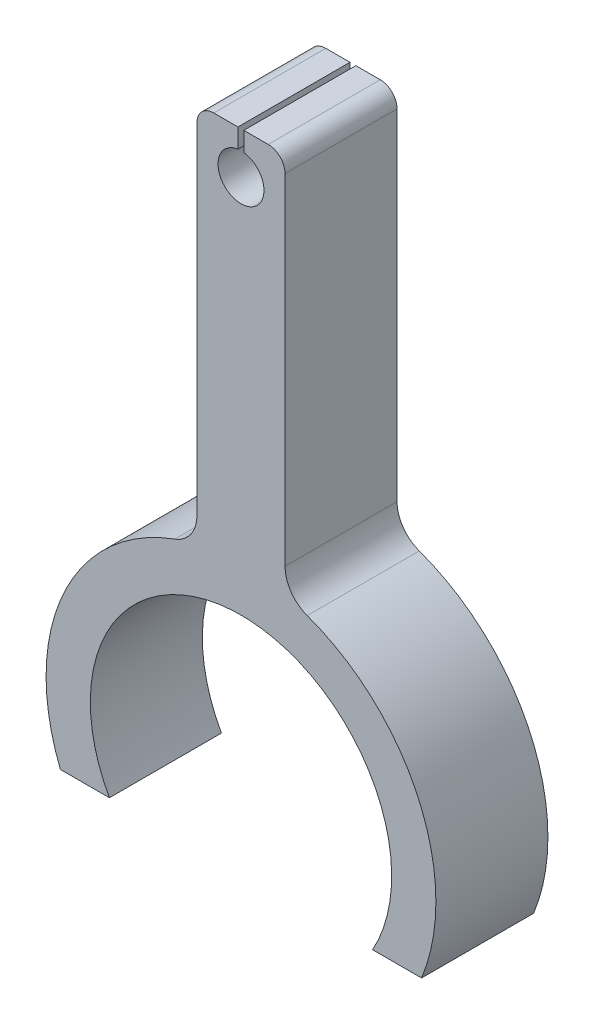
ISO-10303-21;
HEADER;
FILE_DESCRIPTION(('STEP AP214'),'2;1');
FILE_NAME('part.step','',(''),(''),'','','');
FILE_SCHEMA(('AUTOMOTIVE_DESIGN { 1 0 10303 214 1 1 1 1 }'));
ENDSEC;
DATA;
#1=APPLICATION_CONTEXT('core data for automotive mechanical design processes');
#2=APPLICATION_PROTOCOL_DEFINITION('international standard','automotive_design',2000,#1);
#3=PRODUCT_CONTEXT('',#1,'mechanical');
#4=PRODUCT('Part','Part','',(#3));
#5=PRODUCT_RELATED_PRODUCT_CATEGORY('part','',(#4));
#6=PRODUCT_DEFINITION_FORMATION('','',#4);
#7=PRODUCT_DEFINITION_CONTEXT('part definition',#1,'design');
#8=PRODUCT_DEFINITION('design','',#6,#7);
#9=PRODUCT_DEFINITION_SHAPE('','',#8);
#10=(LENGTH_UNIT() NAMED_UNIT(*) SI_UNIT(.MILLI.,.METRE.));
#11=(NAMED_UNIT(*) PLANE_ANGLE_UNIT() SI_UNIT($,.RADIAN.));
#12=(NAMED_UNIT(*) SI_UNIT($,.STERADIAN.) SOLID_ANGLE_UNIT());
#13=UNCERTAINTY_MEASURE_WITH_UNIT(LENGTH_MEASURE(1.E-05),#10,'distance_accuracy_value','');
#14=(GEOMETRIC_REPRESENTATION_CONTEXT(3) GLOBAL_UNCERTAINTY_ASSIGNED_CONTEXT((#13)) GLOBAL_UNIT_ASSIGNED_CONTEXT((#10,
#11,#12)) REPRESENTATION_CONTEXT('',''));
#15=CARTESIAN_POINT('',(0.,0.,0.));
#16=DIRECTION('',(0.,0.,1.));
#17=DIRECTION('',(1.,0.,0.));
#18=AXIS2_PLACEMENT_3D('',#15,#16,#17);
#19=CARTESIAN_POINT('',(-3.93291922947712,51.0522626497168,10.));
#20=DIRECTION('',(0.,1.,0.));
#21=DIRECTION('',(0.,0.,1.));
#22=AXIS2_PLACEMENT_3D('',#19,#20,#21);
#23=PLANE('',#22);
#24=DIRECTION('',(0.,0.,1.));
#25=VECTOR('',#24,1.);
#26=CARTESIAN_POINT('',(-0.269258515594854,51.0522626497168,0.));
#27=LINE('',#26,#25);
#28=CARTESIAN_POINT('',(-0.269258515594854,51.0522626497168,0.));
#29=VERTEX_POINT('',#28);
#30=CARTESIAN_POINT('',(-0.269258515594854,51.0522626497168,10.));
#31=VERTEX_POINT('',#30);
#32=EDGE_CURVE('E177',#29,#31,#27,.T.);
#33=ORIENTED_EDGE('',*,*,#32,.F.);
#34=DIRECTION('',(1.,0.,0.));
#35=VECTOR('',#34,1.);
#36=CARTESIAN_POINT('',(-3.93291922947712,51.0522626497168,0.));
#37=LINE('',#36,#35);
#38=CARTESIAN_POINT('',(-2.43291922947712,51.0522626497168,0.));
#39=VERTEX_POINT('',#38);
#40=EDGE_CURVE('E202',#39,#29,#37,.T.);
#41=ORIENTED_EDGE('',*,*,#40,.F.);
#42=DIRECTION('',(0.,0.,-1.));
#43=VECTOR('',#42,1.);
#44=CARTESIAN_POINT('',(-2.43291922947712,51.0522626497168,10.));
#45=LINE('',#44,#43);
#46=CARTESIAN_POINT('',(-2.43291922947712,51.0522626497168,10.));
#47=VERTEX_POINT('',#46);
#48=EDGE_CURVE('E241',#39,#47,#45,.F.);
#49=ORIENTED_EDGE('',*,*,#48,.T.);
#50=DIRECTION('',(1.,0.,0.));
#51=VECTOR('',#50,1.);
#52=CARTESIAN_POINT('',(-3.93291922947712,51.0522626497168,10.));
#53=LINE('',#52,#51);
#54=EDGE_CURVE('E180',#47,#31,#53,.T.);
#55=ORIENTED_EDGE('',*,*,#54,.T.);
#56=EDGE_LOOP('',(#33,#41,#49,#55));
#57=FACE_BOUND('',#56,.T.);
#58=ADVANCED_FACE('F33',(#57),#23,.T.);
#59=DIRECTION('',(0.,0.,1.));
#60=VECTOR('',#59,1.);
#61=CARTESIAN_POINT('',(0.25121281518814,51.0522626497168,0.));
#62=LINE('',#61,#60);
#63=CARTESIAN_POINT('',(0.25121281518814,51.0522626497168,0.));
#64=VERTEX_POINT('',#63);
#65=CARTESIAN_POINT('',(0.25121281518814,51.0522626497168,10.));
#66=VERTEX_POINT('',#65);
#67=EDGE_CURVE('E48',#64,#66,#62,.T.);
#68=ORIENTED_EDGE('',*,*,#67,.T.);
#69=CARTESIAN_POINT('',(2.43291922947712,51.0522626497168,10.));
#70=VERTEX_POINT('',#69);
#71=EDGE_CURVE('E184',#66,#70,#53,.T.);
#72=ORIENTED_EDGE('',*,*,#71,.T.);
#73=DIRECTION('',(0.,0.,-1.));
#74=VECTOR('',#73,1.);
#75=CARTESIAN_POINT('',(2.43291922947712,51.0522626497168,10.));
#76=LINE('',#75,#74);
#77=CARTESIAN_POINT('',(2.43291922947712,51.0522626497168,0.));
#78=VERTEX_POINT('',#77);
#79=EDGE_CURVE('E238',#70,#78,#76,.T.);
#80=ORIENTED_EDGE('',*,*,#79,.T.);
#81=EDGE_CURVE('E176',#64,#78,#37,.T.);
#82=ORIENTED_EDGE('',*,*,#81,.F.);
#83=EDGE_LOOP('',(#68,#72,#80,#82));
#84=FACE_BOUND('',#83,.T.);
#85=ADVANCED_FACE('F284',(#84),#23,.T.);
#86=CARTESIAN_POINT('',(-3.93291922947712,51.0522626497168,10.));
#87=DIRECTION('',(1.,0.,0.));
#88=DIRECTION('',(0.,1.,0.));
#89=AXIS2_PLACEMENT_3D('',#86,#87,#88);
#90=PLANE('',#89);
#91=DIRECTION('',(0.,-1.,0.));
#92=VECTOR('',#91,1.);
#93=CARTESIAN_POINT('',(-3.93291922947712,51.0522626497168,0.));
#94=LINE('',#93,#92);
#95=CARTESIAN_POINT('',(-3.93291922947712,49.5522626497168,0.));
#96=VERTEX_POINT('',#95);
#97=CARTESIAN_POINT('',(-3.93291922947713,19.1857924245402,0.));
#98=VERTEX_POINT('',#97);
#99=EDGE_CURVE('E219',#96,#98,#94,.T.);
#100=ORIENTED_EDGE('',*,*,#99,.T.);
#101=DIRECTION('',(0.,0.,1.));
#102=VECTOR('',#101,1.);
#103=CARTESIAN_POINT('',(-3.93291922947713,19.1857924245402,10.));
#104=LINE('',#103,#102);
#105=CARTESIAN_POINT('',(-3.93291922947713,19.1857924245402,10.));
#106=VERTEX_POINT('',#105);
#107=EDGE_CURVE('E253',#98,#106,#104,.T.);
#108=ORIENTED_EDGE('',*,*,#107,.T.);
#109=DIRECTION('',(0.,-1.,0.));
#110=VECTOR('',#109,1.);
#111=CARTESIAN_POINT('',(-3.93291922947712,51.0522626497168,10.));
#112=LINE('',#111,#110);
#113=CARTESIAN_POINT('',(-3.93291922947712,49.5522626497168,10.));
#114=VERTEX_POINT('',#113);
#115=EDGE_CURVE('E198',#114,#106,#112,.T.);
#116=ORIENTED_EDGE('',*,*,#115,.F.);
#117=DIRECTION('',(0.,0.,-1.));
#118=VECTOR('',#117,1.);
#119=CARTESIAN_POINT('',(-3.93291922947712,49.5522626497168,0.));
#120=LINE('',#119,#118);
#121=EDGE_CURVE('E225',#114,#96,#120,.T.);
#122=ORIENTED_EDGE('',*,*,#121,.T.);
#123=EDGE_LOOP('',(#100,#108,#116,#122));
#124=FACE_BOUND('',#123,.T.);
#125=ADVANCED_FACE('F286',(#124),#90,.F.);
#126=CARTESIAN_POINT('',(0.,0.,10.));
#127=DIRECTION('',(0.,0.,-1.));
#128=DIRECTION('',(-1.,0.,0.));
#129=AXIS2_PLACEMENT_3D('',#126,#127,#128);
#130=CYLINDRICAL_SURFACE('',#129,17.4);
#131=CARTESIAN_POINT('',(0.,0.,10.));
#132=DIRECTION('',(0.,0.,1.));
#133=DIRECTION('',(1.,0.,0.));
#134=AXIS2_PLACEMENT_3D('',#131,#132,#133);
#135=CIRCLE('',#134,17.4);
#136=CARTESIAN_POINT('',(-5.91337228396579,16.3643523621079,10.));
#137=VERTEX_POINT('',#136);
#138=CARTESIAN_POINT('',(-16.1199720501201,-6.55030542061571,10.));
#139=VERTEX_POINT('',#138);
#140=EDGE_CURVE('E196',#137,#139,#135,.T.);
#141=ORIENTED_EDGE('',*,*,#140,.F.);
#142=DIRECTION('',(0.,0.,-1.));
#143=VECTOR('',#142,1.);
#144=CARTESIAN_POINT('',(-5.91337228396579,16.3643523621079,10.));
#145=LINE('',#144,#143);
#146=CARTESIAN_POINT('',(-5.91337228396579,16.3643523621079,0.));
#147=VERTEX_POINT('',#146);
#148=EDGE_CURVE('E250',#137,#147,#145,.T.);
#149=ORIENTED_EDGE('',*,*,#148,.T.);
#150=CARTESIAN_POINT('',(0.,0.,0.));
#151=DIRECTION('',(0.,0.,1.));
#152=DIRECTION('',(1.,0.,0.));
#153=AXIS2_PLACEMENT_3D('',#150,#151,#152);
#154=CIRCLE('',#153,17.4);
#155=CARTESIAN_POINT('',(-16.1199720501201,-6.55030542061571,0.));
#156=VERTEX_POINT('',#155);
#157=EDGE_CURVE('E217',#147,#156,#154,.T.);
#158=ORIENTED_EDGE('',*,*,#157,.T.);
#159=DIRECTION('',(0.,0.,-1.));
#160=VECTOR('',#159,1.);
#161=CARTESIAN_POINT('',(-16.1199720501201,-6.55030542061571,10.));
#162=LINE('',#161,#160);
#163=EDGE_CURVE('E222',#139,#156,#162,.T.);
#164=ORIENTED_EDGE('',*,*,#163,.F.);
#165=EDGE_LOOP('',(#141,#149,#158,#164));
#166=FACE_BOUND('',#165,.T.);
#167=ADVANCED_FACE('F292',(#166),#130,.T.);
#168=CARTESIAN_POINT('',(-16.1199720501201,-6.55030542061571,10.));
#169=DIRECTION('',(0.,1.,0.));
#170=DIRECTION('',(0.,0.,1.));
#171=AXIS2_PLACEMENT_3D('',#168,#169,#170);
#172=PLANE('',#171);
#173=DIRECTION('',(1.,0.,0.));
#174=VECTOR('',#173,1.);
#175=CARTESIAN_POINT('',(-16.1199720501201,-6.55030542061571,0.));
#176=LINE('',#175,#174);
#177=CARTESIAN_POINT('',(-11.7471698249686,-6.5503054206157,0.));
#178=VERTEX_POINT('',#177);
#179=EDGE_CURVE('E214',#156,#178,#176,.T.);
#180=ORIENTED_EDGE('',*,*,#179,.T.);
#181=DIRECTION('',(0.,0.,-1.));
#182=VECTOR('',#181,1.);
#183=CARTESIAN_POINT('',(-11.7471698249686,-6.5503054206157,10.));
#184=LINE('',#183,#182);
#185=CARTESIAN_POINT('',(-11.7471698249686,-6.5503054206157,10.));
#186=VERTEX_POINT('',#185);
#187=EDGE_CURVE('E226',#186,#178,#184,.T.);
#188=ORIENTED_EDGE('',*,*,#187,.F.);
#189=DIRECTION('',(1.,0.,0.));
#190=VECTOR('',#189,1.);
#191=CARTESIAN_POINT('',(-16.1199720501201,-6.55030542061571,10.));
#192=LINE('',#191,#190);
#193=EDGE_CURVE('E194',#139,#186,#192,.T.);
#194=ORIENTED_EDGE('',*,*,#193,.F.);
#195=ORIENTED_EDGE('',*,*,#163,.T.);
#196=EDGE_LOOP('',(#180,#188,#194,#195));
#197=FACE_BOUND('',#196,.T.);
#198=ADVANCED_FACE('F322',(#197),#172,.F.);
#199=CARTESIAN_POINT('',(0.,0.,10.));
#200=DIRECTION('',(0.,0.,-1.));
#201=DIRECTION('',(-1.,0.,0.));
#202=AXIS2_PLACEMENT_3D('',#199,#200,#201);
#203=CYLINDRICAL_SURFACE('',#202,13.45);
#204=CARTESIAN_POINT('',(0.,0.,0.));
#205=DIRECTION('',(0.,0.,1.));
#206=DIRECTION('',(1.,0.,0.));
#207=AXIS2_PLACEMENT_3D('',#204,#205,#206);
#208=CIRCLE('',#207,13.45);
#209=CARTESIAN_POINT('',(11.7471698249686,-6.55030542061571,0.));
#210=VERTEX_POINT('',#209);
#211=EDGE_CURVE('E211',#210,#178,#208,.T.);
#212=ORIENTED_EDGE('',*,*,#211,.F.);
#213=DIRECTION('',(0.,0.,-1.));
#214=VECTOR('',#213,1.);
#215=CARTESIAN_POINT('',(11.7471698249686,-6.55030542061571,10.));
#216=LINE('',#215,#214);
#217=CARTESIAN_POINT('',(11.7471698249686,-6.55030542061571,10.));
#218=VERTEX_POINT('',#217);
#219=EDGE_CURVE('E228',#218,#210,#216,.T.);
#220=ORIENTED_EDGE('',*,*,#219,.F.);
#221=CARTESIAN_POINT('',(0.,0.,10.));
#222=DIRECTION('',(0.,0.,1.));
#223=DIRECTION('',(1.,0.,0.));
#224=AXIS2_PLACEMENT_3D('',#221,#222,#223);
#225=CIRCLE('',#224,13.45);
#226=EDGE_CURVE('E191',#218,#186,#225,.T.);
#227=ORIENTED_EDGE('',*,*,#226,.T.);
#228=ORIENTED_EDGE('',*,*,#187,.T.);
#229=EDGE_LOOP('',(#212,#220,#227,#228));
#230=FACE_BOUND('',#229,.T.);
#231=ADVANCED_FACE('F327',(#230),#203,.F.);
#232=CARTESIAN_POINT('',(11.7471698249686,-6.55030542061571,10.));
#233=DIRECTION('',(0.,1.,0.));
#234=DIRECTION('',(0.,0.,1.));
#235=AXIS2_PLACEMENT_3D('',#232,#233,#234);
#236=PLANE('',#235);
#237=DIRECTION('',(1.,0.,0.));
#238=VECTOR('',#237,1.);
#239=CARTESIAN_POINT('',(11.7471698249686,-6.55030542061571,0.));
#240=LINE('',#239,#238);
#241=CARTESIAN_POINT('',(16.1199720501201,-6.55030542061571,0.));
#242=VERTEX_POINT('',#241);
#243=EDGE_CURVE('E209',#210,#242,#240,.T.);
#244=ORIENTED_EDGE('',*,*,#243,.T.);
#245=DIRECTION('',(0.,0.,-1.));
#246=VECTOR('',#245,1.);
#247=CARTESIAN_POINT('',(16.1199720501201,-6.55030542061571,10.));
#248=LINE('',#247,#246);
#249=CARTESIAN_POINT('',(16.1199720501201,-6.55030542061571,10.));
#250=VERTEX_POINT('',#249);
#251=EDGE_CURVE('E201',#250,#242,#248,.T.);
#252=ORIENTED_EDGE('',*,*,#251,.F.);
#253=DIRECTION('',(1.,0.,0.));
#254=VECTOR('',#253,1.);
#255=CARTESIAN_POINT('',(11.7471698249686,-6.55030542061571,10.));
#256=LINE('',#255,#254);
#257=EDGE_CURVE('E189',#218,#250,#256,.T.);
#258=ORIENTED_EDGE('',*,*,#257,.F.);
#259=ORIENTED_EDGE('',*,*,#219,.T.);
#260=EDGE_LOOP('',(#244,#252,#258,#259));
#261=FACE_BOUND('',#260,.T.);
#262=ADVANCED_FACE('F329',(#261),#236,.F.);
#263=CARTESIAN_POINT('',(0.,0.,10.));
#264=DIRECTION('',(0.,0.,-1.));
#265=DIRECTION('',(-1.,0.,0.));
#266=AXIS2_PLACEMENT_3D('',#263,#264,#265);
#267=CYLINDRICAL_SURFACE('',#266,17.4);
#268=CARTESIAN_POINT('',(0.,0.,0.));
#269=DIRECTION('',(0.,0.,1.));
#270=DIRECTION('',(1.,0.,0.));
#271=AXIS2_PLACEMENT_3D('',#268,#269,#270);
#272=CIRCLE('',#271,17.4);
#273=CARTESIAN_POINT('',(5.91337228396579,16.3643523621079,0.));
#274=VERTEX_POINT('',#273);
#275=EDGE_CURVE('E207',#242,#274,#272,.T.);
#276=ORIENTED_EDGE('',*,*,#275,.T.);
#277=DIRECTION('',(0.,0.,-1.));
#278=VECTOR('',#277,1.);
#279=CARTESIAN_POINT('',(5.91337228396579,16.3643523621079,10.));
#280=LINE('',#279,#278);
#281=CARTESIAN_POINT('',(5.91337228396579,16.3643523621079,10.));
#282=VERTEX_POINT('',#281);
#283=EDGE_CURVE('E56',#274,#282,#280,.F.);
#284=ORIENTED_EDGE('',*,*,#283,.T.);
#285=CARTESIAN_POINT('',(0.,0.,10.));
#286=DIRECTION('',(0.,0.,1.));
#287=DIRECTION('',(1.,0.,0.));
#288=AXIS2_PLACEMENT_3D('',#285,#286,#287);
#289=CIRCLE('',#288,17.4);
#290=EDGE_CURVE('E187',#250,#282,#289,.T.);
#291=ORIENTED_EDGE('',*,*,#290,.F.);
#292=ORIENTED_EDGE('',*,*,#251,.T.);
#293=EDGE_LOOP('',(#276,#284,#291,#292));
#294=FACE_BOUND('',#293,.T.);
#295=ADVANCED_FACE('F267',(#294),#267,.T.);
#296=CARTESIAN_POINT('',(3.93291922947712,51.0522626497168,10.));
#297=DIRECTION('',(1.,0.,0.));
#298=DIRECTION('',(0.,1.,0.));
#299=AXIS2_PLACEMENT_3D('',#296,#297,#298);
#300=PLANE('',#299);
#301=DIRECTION('',(0.,-1.,0.));
#302=VECTOR('',#301,1.);
#303=CARTESIAN_POINT('',(3.93291922947712,51.0522626497168,10.));
#304=LINE('',#303,#302);
#305=CARTESIAN_POINT('',(3.93291922947712,49.5522626497168,10.));
#306=VERTEX_POINT('',#305);
#307=CARTESIAN_POINT('',(3.93291922947713,19.1857924245402,10.));
#308=VERTEX_POINT('',#307);
#309=EDGE_CURVE('E183',#306,#308,#304,.T.);
#310=ORIENTED_EDGE('',*,*,#309,.T.);
#311=DIRECTION('',(0.,0.,-1.));
#312=VECTOR('',#311,1.);
#313=CARTESIAN_POINT('',(3.93291922947713,19.1857924245402,10.));
#314=LINE('',#313,#312);
#315=CARTESIAN_POINT('',(3.93291922947713,19.1857924245402,0.));
#316=VERTEX_POINT('',#315);
#317=EDGE_CURVE('E255',#308,#316,#314,.T.);
#318=ORIENTED_EDGE('',*,*,#317,.T.);
#319=DIRECTION('',(0.,-1.,0.));
#320=VECTOR('',#319,1.);
#321=CARTESIAN_POINT('',(3.93291922947712,51.0522626497168,0.));
#322=LINE('',#321,#320);
#323=CARTESIAN_POINT('',(3.93291922947712,49.5522626497168,0.));
#324=VERTEX_POINT('',#323);
#325=EDGE_CURVE('E204',#324,#316,#322,.T.);
#326=ORIENTED_EDGE('',*,*,#325,.F.);
#327=DIRECTION('',(0.,0.,-1.));
#328=VECTOR('',#327,1.);
#329=CARTESIAN_POINT('',(3.93291922947712,49.5522626497168,10.));
#330=LINE('',#329,#328);
#331=EDGE_CURVE('E248',#324,#306,#330,.F.);
#332=ORIENTED_EDGE('',*,*,#331,.T.);
#333=EDGE_LOOP('',(#310,#318,#326,#332));
#334=FACE_BOUND('',#333,.T.);
#335=ADVANCED_FACE('F276',(#334),#300,.T.);
#336=CARTESIAN_POINT('',(0.,0.,10.));
#337=DIRECTION('',(0.,0.,1.));
#338=DIRECTION('',(1.,0.,0.));
#339=AXIS2_PLACEMENT_3D('',#336,#337,#338);
#340=PLANE('',#339);
#341=DIRECTION('',(0.,-1.,0.));
#342=VECTOR('',#341,1.);
#343=CARTESIAN_POINT('',(-0.269258515594854,49.3312106101358,10.));
#344=LINE('',#343,#342);
#345=CARTESIAN_POINT('',(-0.269258515594854,49.3312106101358,10.));
#346=VERTEX_POINT('',#345);
#347=EDGE_CURVE('E165',#31,#346,#344,.T.);
#348=ORIENTED_EDGE('',*,*,#347,.F.);
#349=ORIENTED_EDGE('',*,*,#54,.F.);
#350=CARTESIAN_POINT('',(-2.43291922947712,49.5522626497168,10.));
#351=DIRECTION('',(0.,0.,1.));
#352=DIRECTION('',(1.,0.,0.));
#353=AXIS2_PLACEMENT_3D('',#350,#351,#352);
#354=CIRCLE('',#353,1.5);
#355=EDGE_CURVE('E246',#47,#114,#354,.T.);
#356=ORIENTED_EDGE('',*,*,#355,.T.);
#357=ORIENTED_EDGE('',*,*,#115,.T.);
#358=CARTESIAN_POINT('',(-6.93291922947713,19.1857924245402,10.));
#359=DIRECTION('',(0.,0.,1.));
#360=DIRECTION('',(1.,0.,0.));
#361=AXIS2_PLACEMENT_3D('',#358,#359,#360);
#362=CIRCLE('',#361,3.);
#363=EDGE_CURVE('E261',#106,#137,#362,.F.);
#364=ORIENTED_EDGE('',*,*,#363,.T.);
#365=ORIENTED_EDGE('',*,*,#140,.T.);
#366=ORIENTED_EDGE('',*,*,#193,.T.);
#367=ORIENTED_EDGE('',*,*,#226,.F.);
#368=ORIENTED_EDGE('',*,*,#257,.T.);
#369=ORIENTED_EDGE('',*,*,#290,.T.);
#370=CARTESIAN_POINT('',(6.93291922947713,19.1857924245402,10.));
#371=DIRECTION('',(0.,0.,1.));
#372=DIRECTION('',(1.,0.,0.));
#373=AXIS2_PLACEMENT_3D('',#370,#371,#372);
#374=CIRCLE('',#373,3.);
#375=EDGE_CURVE('E11',#282,#308,#374,.F.);
#376=ORIENTED_EDGE('',*,*,#375,.T.);
#377=ORIENTED_EDGE('',*,*,#309,.F.);
#378=CARTESIAN_POINT('',(2.43291922947712,49.5522626497168,10.));
#379=DIRECTION('',(0.,0.,1.));
#380=DIRECTION('',(1.,0.,0.));
#381=AXIS2_PLACEMENT_3D('',#378,#379,#380);
#382=CIRCLE('',#381,1.5);
#383=EDGE_CURVE('E243',#306,#70,#382,.T.);
#384=ORIENTED_EDGE('',*,*,#383,.T.);
#385=ORIENTED_EDGE('',*,*,#71,.F.);
#386=DIRECTION('',(0.,1.,0.));
#387=VECTOR('',#386,1.);
#388=CARTESIAN_POINT('',(0.25121281518814,51.0522626497168,10.));
#389=LINE('',#388,#387);
#390=CARTESIAN_POINT('',(0.25121281518814,49.3335201147712,10.));
#391=VERTEX_POINT('',#390);
#392=EDGE_CURVE('E168',#391,#66,#389,.T.);
#393=ORIENTED_EDGE('',*,*,#392,.F.);
#394=CARTESIAN_POINT('',(0.,47.2989705033129,10.));
#395=DIRECTION('',(0.,0.,1.));
#396=DIRECTION('',(1.,0.,0.));
#397=AXIS2_PLACEMENT_3D('',#394,#395,#396);
#398=CIRCLE('',#397,2.05);
#399=EDGE_CURVE('E154',#346,#391,#398,.T.);
#400=ORIENTED_EDGE('',*,*,#399,.F.);
#401=EDGE_LOOP('',(#348,#349,#356,#357,#364,#365,#366,#367,#368,#369,#376,#377,#384,#385,#393,#400));
#402=FACE_BOUND('',#401,.T.);
#403=ADVANCED_FACE('F273',(#402),#340,.T.);
#404=CARTESIAN_POINT('',(0.,0.,0.));
#405=DIRECTION('',(0.,0.,1.));
#406=DIRECTION('',(1.,0.,0.));
#407=AXIS2_PLACEMENT_3D('',#404,#405,#406);
#408=PLANE('',#407);
#409=ORIENTED_EDGE('',*,*,#40,.T.);
#410=DIRECTION('',(0.,-1.,0.));
#411=VECTOR('',#410,1.);
#412=CARTESIAN_POINT('',(-0.269258515594854,49.3312106101358,0.));
#413=LINE('',#412,#411);
#414=CARTESIAN_POINT('',(-0.269258515594854,49.3312106101358,0.));
#415=VERTEX_POINT('',#414);
#416=EDGE_CURVE('E156',#29,#415,#413,.T.);
#417=ORIENTED_EDGE('',*,*,#416,.T.);
#418=CARTESIAN_POINT('',(0.,47.2989705033129,0.));
#419=DIRECTION('',(0.,0.,1.));
#420=DIRECTION('',(1.,0.,0.));
#421=AXIS2_PLACEMENT_3D('',#418,#419,#420);
#422=CIRCLE('',#421,2.05);
#423=CARTESIAN_POINT('',(0.25121281518814,49.3335201147712,0.));
#424=VERTEX_POINT('',#423);
#425=EDGE_CURVE('E151',#415,#424,#422,.T.);
#426=ORIENTED_EDGE('',*,*,#425,.T.);
#427=DIRECTION('',(0.,1.,0.));
#428=VECTOR('',#427,1.);
#429=CARTESIAN_POINT('',(0.25121281518814,51.0522626497168,0.));
#430=LINE('',#429,#428);
#431=EDGE_CURVE('E158',#424,#64,#430,.T.);
#432=ORIENTED_EDGE('',*,*,#431,.T.);
#433=ORIENTED_EDGE('',*,*,#81,.T.);
#434=CARTESIAN_POINT('',(2.43291922947712,49.5522626497168,0.));
#435=DIRECTION('',(0.,0.,1.));
#436=DIRECTION('',(1.,0.,0.));
#437=AXIS2_PLACEMENT_3D('',#434,#435,#436);
#438=CIRCLE('',#437,1.5);
#439=EDGE_CURVE('E234',#78,#324,#438,.F.);
#440=ORIENTED_EDGE('',*,*,#439,.T.);
#441=ORIENTED_EDGE('',*,*,#325,.T.);
#442=CARTESIAN_POINT('',(6.93291922947713,19.1857924245402,0.));
#443=DIRECTION('',(0.,0.,1.));
#444=DIRECTION('',(1.,0.,0.));
#445=AXIS2_PLACEMENT_3D('',#442,#443,#444);
#446=CIRCLE('',#445,3.);
#447=EDGE_CURVE('E41',#316,#274,#446,.T.);
#448=ORIENTED_EDGE('',*,*,#447,.T.);
#449=ORIENTED_EDGE('',*,*,#275,.F.);
#450=ORIENTED_EDGE('',*,*,#243,.F.);
#451=ORIENTED_EDGE('',*,*,#211,.T.);
#452=ORIENTED_EDGE('',*,*,#179,.F.);
#453=ORIENTED_EDGE('',*,*,#157,.F.);
#454=CARTESIAN_POINT('',(-6.93291922947713,19.1857924245402,0.));
#455=DIRECTION('',(0.,0.,1.));
#456=DIRECTION('',(1.,0.,0.));
#457=AXIS2_PLACEMENT_3D('',#454,#455,#456);
#458=CIRCLE('',#457,3.);
#459=EDGE_CURVE('E259',#147,#98,#458,.T.);
#460=ORIENTED_EDGE('',*,*,#459,.T.);
#461=ORIENTED_EDGE('',*,*,#99,.F.);
#462=CARTESIAN_POINT('',(-2.43291922947712,49.5522626497168,0.));
#463=DIRECTION('',(0.,0.,1.));
#464=DIRECTION('',(1.,0.,0.));
#465=AXIS2_PLACEMENT_3D('',#462,#463,#464);
#466=CIRCLE('',#465,1.5);
#467=EDGE_CURVE('E236',#96,#39,#466,.F.);
#468=ORIENTED_EDGE('',*,*,#467,.T.);
#469=EDGE_LOOP('',(#409,#417,#426,#432,#433,#440,#441,#448,#449,#450,#451,#452,#453,#460,#461,#468));
#470=FACE_BOUND('',#469,.T.);
#471=ADVANCED_FACE('F164',(#470),#408,.F.);
#472=CARTESIAN_POINT('',(-2.43291922947712,49.5522626497168,10.));
#473=DIRECTION('',(0.,0.,1.));
#474=DIRECTION('',(1.,0.,0.));
#475=AXIS2_PLACEMENT_3D('',#472,#473,#474);
#476=CYLINDRICAL_SURFACE('',#475,1.5);
#477=ORIENTED_EDGE('',*,*,#355,.F.);
#478=ORIENTED_EDGE('',*,*,#48,.F.);
#479=ORIENTED_EDGE('',*,*,#467,.F.);
#480=ORIENTED_EDGE('',*,*,#121,.F.);
#481=EDGE_LOOP('',(#477,#478,#479,#480));
#482=FACE_BOUND('',#481,.T.);
#483=ADVANCED_FACE('F299',(#482),#476,.T.);
#484=CARTESIAN_POINT('',(2.43291922947712,49.5522626497168,10.));
#485=DIRECTION('',(0.,0.,-1.));
#486=DIRECTION('',(-1.,0.,0.));
#487=AXIS2_PLACEMENT_3D('',#484,#485,#486);
#488=CYLINDRICAL_SURFACE('',#487,1.5);
#489=ORIENTED_EDGE('',*,*,#383,.F.);
#490=ORIENTED_EDGE('',*,*,#331,.F.);
#491=ORIENTED_EDGE('',*,*,#439,.F.);
#492=ORIENTED_EDGE('',*,*,#79,.F.);
#493=EDGE_LOOP('',(#489,#490,#491,#492));
#494=FACE_BOUND('',#493,.T.);
#495=ADVANCED_FACE('F280',(#494),#488,.T.);
#496=CARTESIAN_POINT('',(-6.93291922947713,19.1857924245402,10.));
#497=DIRECTION('',(0.,0.,-1.));
#498=DIRECTION('',(-1.,0.,0.));
#499=AXIS2_PLACEMENT_3D('',#496,#497,#498);
#500=CYLINDRICAL_SURFACE('',#499,3.);
#501=ORIENTED_EDGE('',*,*,#363,.F.);
#502=ORIENTED_EDGE('',*,*,#107,.F.);
#503=ORIENTED_EDGE('',*,*,#459,.F.);
#504=ORIENTED_EDGE('',*,*,#148,.F.);
#505=EDGE_LOOP('',(#501,#502,#503,#504));
#506=FACE_BOUND('',#505,.T.);
#507=ADVANCED_FACE('F304',(#506),#500,.F.);
#508=CARTESIAN_POINT('',(6.93291922947713,19.1857924245402,10.));
#509=DIRECTION('',(0.,0.,-1.));
#510=DIRECTION('',(-1.,0.,0.));
#511=AXIS2_PLACEMENT_3D('',#508,#509,#510);
#512=CYLINDRICAL_SURFACE('',#511,3.);
#513=ORIENTED_EDGE('',*,*,#375,.F.);
#514=ORIENTED_EDGE('',*,*,#283,.F.);
#515=ORIENTED_EDGE('',*,*,#447,.F.);
#516=ORIENTED_EDGE('',*,*,#317,.F.);
#517=EDGE_LOOP('',(#513,#514,#515,#516));
#518=FACE_BOUND('',#517,.T.);
#519=ADVANCED_FACE('F35',(#518),#512,.F.);
#520=CARTESIAN_POINT('',(0.,47.2989705033129,0.));
#521=DIRECTION('',(0.,0.,1.));
#522=DIRECTION('',(1.,0.,0.));
#523=AXIS2_PLACEMENT_3D('',#520,#521,#522);
#524=CYLINDRICAL_SURFACE('',#523,2.05);
#525=ORIENTED_EDGE('',*,*,#399,.T.);
#526=DIRECTION('',(0.,0.,1.));
#527=VECTOR('',#526,1.);
#528=CARTESIAN_POINT('',(0.25121281518814,49.3335201147712,0.));
#529=LINE('',#528,#527);
#530=EDGE_CURVE('E148',#424,#391,#529,.T.);
#531=ORIENTED_EDGE('',*,*,#530,.F.);
#532=ORIENTED_EDGE('',*,*,#425,.F.);
#533=DIRECTION('',(0.,0.,1.));
#534=VECTOR('',#533,1.);
#535=CARTESIAN_POINT('',(-0.269258515594854,49.3312106101358,0.));
#536=LINE('',#535,#534);
#537=EDGE_CURVE('E174',#415,#346,#536,.T.);
#538=ORIENTED_EDGE('',*,*,#537,.T.);
#539=EDGE_LOOP('',(#525,#531,#532,#538));
#540=FACE_BOUND('',#539,.T.);
#541=ADVANCED_FACE('F149',(#540),#524,.F.);
#542=CARTESIAN_POINT('',(-0.269258515594854,49.3312106101358,0.));
#543=DIRECTION('',(-1.,0.,0.));
#544=DIRECTION('',(0.,-1.,0.));
#545=AXIS2_PLACEMENT_3D('',#542,#543,#544);
#546=PLANE('',#545);
#547=ORIENTED_EDGE('',*,*,#347,.T.);
#548=ORIENTED_EDGE('',*,*,#537,.F.);
#549=ORIENTED_EDGE('',*,*,#416,.F.);
#550=ORIENTED_EDGE('',*,*,#32,.T.);
#551=EDGE_LOOP('',(#547,#548,#549,#550));
#552=FACE_BOUND('',#551,.T.);
#553=ADVANCED_FACE('F338',(#552),#546,.F.);
#554=CARTESIAN_POINT('',(0.25121281518814,51.0522626497168,0.));
#555=DIRECTION('',(1.,0.,0.));
#556=DIRECTION('',(0.,0.,-1.));
#557=AXIS2_PLACEMENT_3D('',#554,#555,#556);
#558=PLANE('',#557);
#559=ORIENTED_EDGE('',*,*,#392,.T.);
#560=ORIENTED_EDGE('',*,*,#67,.F.);
#561=ORIENTED_EDGE('',*,*,#431,.F.);
#562=ORIENTED_EDGE('',*,*,#530,.T.);
#563=EDGE_LOOP('',(#559,#560,#561,#562));
#564=FACE_BOUND('',#563,.T.);
#565=ADVANCED_FACE('F159',(#564),#558,.F.);
#566=CLOSED_SHELL('',(#58,#85,#125,#167,#198,#231,#262,#295,#335,#403,#471,#483,#495,#507,#519,
#541,#553,#565));
#567=MANIFOLD_SOLID_BREP('B2',#566);
#568=ADVANCED_BREP_SHAPE_REPRESENTATION('',(#18,#567),#14);
#569=SHAPE_DEFINITION_REPRESENTATION(#9,#568);
ENDSEC;
END-ISO-10303-21;
